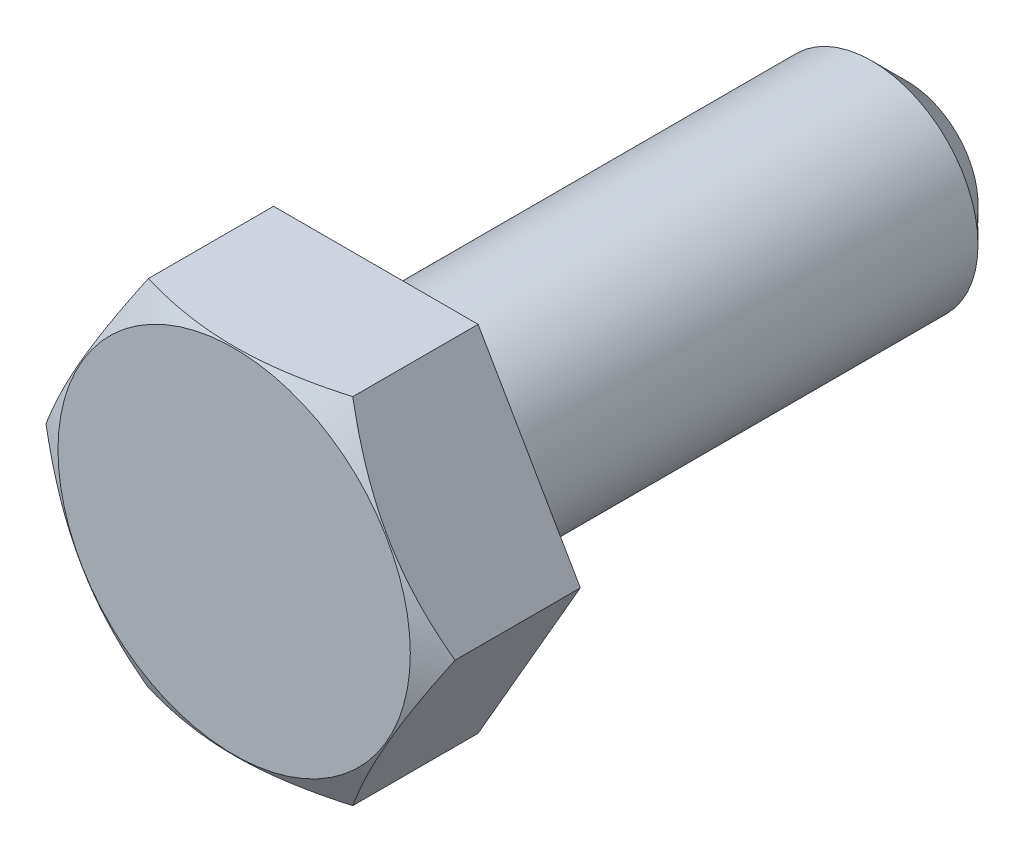
ISO-10303-21;
HEADER;
FILE_DESCRIPTION(('STEP AP214'),'2;1');
FILE_NAME('part.step','',(''),(''),'','','');
FILE_SCHEMA(('AUTOMOTIVE_DESIGN { 1 0 10303 214 1 1 1 1 }'));
ENDSEC;
DATA;
#1=APPLICATION_CONTEXT('core data for automotive mechanical design processes');
#2=APPLICATION_PROTOCOL_DEFINITION('international standard','automotive_design',2000,#1);
#3=PRODUCT_CONTEXT('',#1,'mechanical');
#4=PRODUCT('Part','Part','',(#3));
#5=PRODUCT_RELATED_PRODUCT_CATEGORY('part','',(#4));
#6=PRODUCT_DEFINITION_FORMATION('','',#4);
#7=PRODUCT_DEFINITION_CONTEXT('part definition',#1,'design');
#8=PRODUCT_DEFINITION('design','',#6,#7);
#9=PRODUCT_DEFINITION_SHAPE('','',#8);
#10=(LENGTH_UNIT() NAMED_UNIT(*) SI_UNIT(.MILLI.,.METRE.));
#11=(NAMED_UNIT(*) PLANE_ANGLE_UNIT() SI_UNIT($,.RADIAN.));
#12=(NAMED_UNIT(*) SI_UNIT($,.STERADIAN.) SOLID_ANGLE_UNIT());
#13=UNCERTAINTY_MEASURE_WITH_UNIT(LENGTH_MEASURE(1.E-05),#10,'distance_accuracy_value','');
#14=(GEOMETRIC_REPRESENTATION_CONTEXT(3) GLOBAL_UNCERTAINTY_ASSIGNED_CONTEXT((#13)) GLOBAL_UNIT_ASSIGNED_CONTEXT((#10,
#11,#12)) REPRESENTATION_CONTEXT('',''));
#15=CARTESIAN_POINT('',(0.,0.,0.));
#16=DIRECTION('',(0.,0.,1.));
#17=DIRECTION('',(1.,0.,0.));
#18=AXIS2_PLACEMENT_3D('',#15,#16,#17);
#19=CARTESIAN_POINT('',(2.88675134594813,-5.,4.));
#20=DIRECTION('',(-0.866025403784439,0.5,0.));
#21=DIRECTION('',(-0.5,-0.866025403784439,0.));
#22=AXIS2_PLACEMENT_3D('',#19,#20,#21);
#23=PLANE('',#22);
#24=CARTESIAN_POINT('',(2.88663587589429,-5.0002,3.53805311598168));
#25=CARTESIAN_POINT('',(3.01349970319368,-4.78046540547481,3.61131520439587));
#26=CARTESIAN_POINT('',(3.14144859993849,-4.55885141554042,3.67795045011541));
#27=CARTESIAN_POINT('',(3.39956193532121,-4.11178600454649,3.79426278102269));
#28=CARTESIAN_POINT('',(3.52973095989718,-3.88632664040923,3.84389872211772));
#29=CARTESIAN_POINT('',(3.78847564779798,-3.43816769477649,3.92115074661481));
#30=CARTESIAN_POINT('',(3.91701101576052,-3.21553790689581,3.94928139375001));
#31=CARTESIAN_POINT('',(4.11026620624322,-2.88081009815336,3.97450685007982));
#32=CARTESIAN_POINT('',(4.17472868879311,-2.76915780319494,3.98008831226402));
#33=CARTESIAN_POINT('',(4.30371322717528,-2.5457500293262,3.98549955528203));
#34=CARTESIAN_POINT('',(4.36823528110589,-2.43399455370969,3.9853295137753));
#35=CARTESIAN_POINT('',(4.54500768479194,-2.12781576914936,3.97694814024147));
#36=CARTESIAN_POINT('',(4.65719946015292,-1.93349391403279,3.96287200013625));
#37=CARTESIAN_POINT('',(4.88083840557981,-1.54613989800229,3.91823651492407));
#38=CARTESIAN_POINT('',(4.9922847895602,-1.35310909862843,3.887661911886));
#39=CARTESIAN_POINT('',(5.21637431361295,-0.964974657525144,3.81123327841234));
#40=CARTESIAN_POINT('',(5.32898917185759,-0.769920001358263,3.76505539315483));
#41=CARTESIAN_POINT('',(5.55253939626498,-0.382719654641229,3.66024997754157));
#42=CARTESIAN_POINT('',(5.66347762579592,-0.190569004591911,3.60164706859613));
#43=CARTESIAN_POINT('',(5.7736181619501,0.000200000000002566,3.53805311598168));
#44=B_SPLINE_CURVE_WITH_KNOTS('',3,(#24,#25,#26,#27,#28,#29,#30,#31,#32,#33,#34,#35,#36,#37,#38,
#39,#40,#41,#42,#43),.UNSPECIFIED.,.F.,.F.,(4,2,2,2,2,2,2,2,2,4),(0.,0.79255584136309,
1.58701660053333,2.3618153748728,2.74884076077325,3.13585419177295,3.80962362599679,
4.48401723901189,5.17336882348928,5.86136694793725),.UNSPECIFIED.);
#45=CARTESIAN_POINT('',(2.88675134594813,-5.,3.53811978464831));
#46=VERTEX_POINT('',#45);
#47=CARTESIAN_POINT('',(5.77350269189626,0.,3.53811978464831));
#48=VERTEX_POINT('',#47);
#49=EDGE_CURVE('E87',#46,#48,#44,.T.);
#50=ORIENTED_EDGE('',*,*,#49,.F.);
#51=DIRECTION('',(0.,0.,-1.));
#52=VECTOR('',#51,1.);
#53=CARTESIAN_POINT('',(2.88675134594813,-5.,4.));
#54=LINE('',#53,#52);
#55=CARTESIAN_POINT('',(2.88675134594813,-5.,0.));
#56=VERTEX_POINT('',#55);
#57=EDGE_CURVE('E56',#46,#56,#54,.T.);
#58=ORIENTED_EDGE('',*,*,#57,.T.);
#59=DIRECTION('',(0.5,0.866025403784439,0.));
#60=VECTOR('',#59,1.);
#61=CARTESIAN_POINT('',(2.88675134594813,-5.,0.));
#62=LINE('',#61,#60);
#63=CARTESIAN_POINT('',(5.77350269189626,0.,0.));
#64=VERTEX_POINT('',#63);
#65=EDGE_CURVE('E95',#56,#64,#62,.T.);
#66=ORIENTED_EDGE('',*,*,#65,.T.);
#67=DIRECTION('',(0.,0.,-1.));
#68=VECTOR('',#67,1.);
#69=CARTESIAN_POINT('',(5.77350269189626,0.,4.));
#70=LINE('',#69,#68);
#71=EDGE_CURVE('E94',#48,#64,#70,.T.);
#72=ORIENTED_EDGE('',*,*,#71,.F.);
#73=EDGE_LOOP('',(#50,#58,#66,#72));
#74=FACE_BOUND('',#73,.T.);
#75=ADVANCED_FACE('F33',(#74),#23,.F.);
#76=CARTESIAN_POINT('',(5.77350269189626,0.,4.));
#77=DIRECTION('',(-0.866025403784438,-0.5,0.));
#78=DIRECTION('',(0.5,-0.866025403784439,0.));
#79=AXIS2_PLACEMENT_3D('',#76,#77,#78);
#80=PLANE('',#79);
#81=CARTESIAN_POINT('',(5.7736181619501,-0.000199999999997309,3.53805311598168));
#82=CARTESIAN_POINT('',(5.64675433465071,0.219534594525188,3.61131520439587));
#83=CARTESIAN_POINT('',(5.5188054379059,0.441148584459583,3.67795045011541));
#84=CARTESIAN_POINT('',(5.26069210252318,0.888213995453515,3.79426278102269));
#85=CARTESIAN_POINT('',(5.13052307794721,1.11367335959078,3.84389872211772));
#86=CARTESIAN_POINT('',(4.87177839004641,1.56183230522351,3.92115074661481));
#87=CARTESIAN_POINT('',(4.74324302208387,1.78446209310419,3.94928139375001));
#88=CARTESIAN_POINT('',(4.54998783160116,2.11918990184664,3.97450685007982));
#89=CARTESIAN_POINT('',(4.48552534905128,2.23084219680506,3.98008831226402));
#90=CARTESIAN_POINT('',(4.35654081066911,2.4542499706738,3.98549955528203));
#91=CARTESIAN_POINT('',(4.2920187567385,2.56600544629031,3.9853295137753));
#92=CARTESIAN_POINT('',(4.11524635305244,2.87218423085064,3.97694814024147));
#93=CARTESIAN_POINT('',(4.00305457769146,3.06650608596721,3.96287200013625));
#94=CARTESIAN_POINT('',(3.77941563226457,3.45386010199771,3.91823651492407));
#95=CARTESIAN_POINT('',(3.66796924828418,3.64689090137157,3.887661911886));
#96=CARTESIAN_POINT('',(3.44387972423144,4.03502534247485,3.81123327841234));
#97=CARTESIAN_POINT('',(3.3312648659868,4.23007999864174,3.76505539315482));
#98=CARTESIAN_POINT('',(3.1077146415794,4.61728034535877,3.66024997754157));
#99=CARTESIAN_POINT('',(2.99677641204847,4.80943099540809,3.60164706859613));
#100=CARTESIAN_POINT('',(2.88663587589429,5.0002,3.53805311598168));
#101=B_SPLINE_CURVE_WITH_KNOTS('',3,(#81,#82,#83,#84,#85,#86,#87,#88,#89,#90,#91,#92,#93,#94,
#95,#96,#97,#98,#99,#100),.UNSPECIFIED.,.F.,.F.,(4,2,2,2,2,2,2,2,2,4),(0.,0.792555841363089,
1.58701660053333,2.3618153748728,2.74884076077325,3.13585419177295,3.80962362599679,
4.48401723901189,5.17336882348928,5.86136694793725),.UNSPECIFIED.);
#102=CARTESIAN_POINT('',(2.88675134594813,5.,3.53811978464831));
#103=VERTEX_POINT('',#102);
#104=EDGE_CURVE('E96',#48,#103,#101,.T.);
#105=ORIENTED_EDGE('',*,*,#104,.F.);
#106=ORIENTED_EDGE('',*,*,#71,.T.);
#107=DIRECTION('',(-0.5,0.866025403784438,0.));
#108=VECTOR('',#107,1.);
#109=CARTESIAN_POINT('',(5.77350269189626,0.,0.));
#110=LINE('',#109,#108);
#111=CARTESIAN_POINT('',(2.88675134594813,5.,0.));
#112=VERTEX_POINT('',#111);
#113=EDGE_CURVE('E282',#64,#112,#110,.T.);
#114=ORIENTED_EDGE('',*,*,#113,.T.);
#115=DIRECTION('',(0.,0.,-1.));
#116=VECTOR('',#115,1.);
#117=CARTESIAN_POINT('',(2.88675134594813,5.,4.));
#118=LINE('',#117,#116);
#119=EDGE_CURVE('E113',#103,#112,#118,.T.);
#120=ORIENTED_EDGE('',*,*,#119,.F.);
#121=EDGE_LOOP('',(#105,#106,#114,#120));
#122=FACE_BOUND('',#121,.T.);
#123=ADVANCED_FACE('F136',(#122),#80,.F.);
#124=CARTESIAN_POINT('',(2.88675134594813,5.,4.));
#125=DIRECTION('',(0.,-1.,0.));
#126=DIRECTION('',(0.,0.,-1.));
#127=AXIS2_PLACEMENT_3D('',#124,#125,#126);
#128=PLANE('',#127);
#129=CARTESIAN_POINT('',(-7.82338516873747,5.,1.51093835730114));
#130=CARTESIAN_POINT('',(-7.60438197690464,5.,1.61745101624925));
#131=CARTESIAN_POINT('',(-7.38488336024556,5.,1.72296210858919));
#132=CARTESIAN_POINT('',(-6.94463201643304,5.,1.93141911387655));
#133=CARTESIAN_POINT('',(-6.72387910419547,5.,2.03436463550559));
#134=CARTESIAN_POINT('',(-6.27975175628989,5.,2.2376314796622));
#135=CARTESIAN_POINT('',(-6.05636963189633,5.,2.33793605953245));
#136=CARTESIAN_POINT('',(-5.6078523892746,5.,2.53453096598181));
#137=CARTESIAN_POINT('',(-5.38271735252268,5.,2.6308214778305));
#138=CARTESIAN_POINT('',(-4.92287041955428,5.,2.82142512951252));
#139=CARTESIAN_POINT('',(-4.68808764320172,5.,2.91556818067449));
#140=CARTESIAN_POINT('',(-4.21580110971377,5.,3.09689531418389));
#141=CARTESIAN_POINT('',(-3.97829705446181,5.,3.18407862559214));
#142=CARTESIAN_POINT('',(-3.50061243500503,5.,3.34924863479384));
#143=CARTESIAN_POINT('',(-3.26043816280424,5.,3.42725335016425));
#144=CARTESIAN_POINT('',(-2.77664517159943,5.,3.57160921336287));
#145=CARTESIAN_POINT('',(-2.53302754080839,5.,3.63796395775378));
#146=CARTESIAN_POINT('',(-2.0435434734644,5.,3.75553285696888));
#147=CARTESIAN_POINT('',(-1.79769726961432,5.,3.80682971688414));
#148=CARTESIAN_POINT('',(-1.30287667014513,5.,3.89142161557658));
#149=CARTESIAN_POINT('',(-1.05390260442688,5.,3.92471853679513));
#150=CARTESIAN_POINT('',(-0.55735108034088,5.,3.97022151473848));
#151=CARTESIAN_POINT('',(-0.309799614974713,5.,3.9827042169782));
#152=CARTESIAN_POINT('',(0.185481530121079,5.,3.98625319724656));
#153=CARTESIAN_POINT('',(0.433211213294336,5.,3.97731904969401));
#154=CARTESIAN_POINT('',(0.851696393111856,5.,3.94477536113387));
#155=CARTESIAN_POINT('',(1.02289114163302,5.,3.92647096501586));
#156=CARTESIAN_POINT('',(1.36406544167886,5.,3.88073644281525));
#157=CARTESIAN_POINT('',(1.53404483327378,5.,3.85330513749713));
#158=CARTESIAN_POINT('',(2.04190752157204,5.,3.75875876729475));
#159=CARTESIAN_POINT('',(2.37754017644565,5.,3.67940671340158));
#160=CARTESIAN_POINT('',(2.87961021742162,5.,3.54129775467678));
#161=CARTESIAN_POINT('',(3.04863466648646,5.,3.49140605188312));
#162=CARTESIAN_POINT('',(3.38504221933191,5.,3.38631753851791));
#163=CARTESIAN_POINT('',(3.55242531088788,5.,3.33112068846725));
#164=CARTESIAN_POINT('',(3.88560260788616,5.,3.21631800828312));
#165=CARTESIAN_POINT('',(4.05139727317292,5.,3.15671350056889));
#166=CARTESIAN_POINT('',(4.38160293931627,5.,3.03380916945681));
#167=CARTESIAN_POINT('',(4.54601396838294,5.,2.97050942160873));
#168=CARTESIAN_POINT('',(4.97818946131638,5.,2.79943040590878));
#169=CARTESIAN_POINT('',(5.24492497437432,5.,2.68905464522093));
#170=CARTESIAN_POINT('',(5.77574777408935,5.,2.46208755306074));
#171=CARTESIAN_POINT('',(6.03983479512499,5.,2.3454956054192));
#172=CARTESIAN_POINT('',(6.56594822395386,5.,2.10752786254936));
#173=CARTESIAN_POINT('',(6.82797388396819,5.,1.98615041937866));
#174=CARTESIAN_POINT('',(7.35027595134517,5.,1.73972418057082));
#175=CARTESIAN_POINT('',(7.61055242142685,5.,1.61467551744153));
#176=CARTESIAN_POINT('',(8.13008095615318,5.,1.36149894749498));
#177=CARTESIAN_POINT('',(8.38933091460936,5.,1.23336672724167));
#178=CARTESIAN_POINT('',(8.90667323229434,5.,0.974783920345941));
#179=CARTESIAN_POINT('',(9.16476557965033,5.,0.844333309993208));
#180=CARTESIAN_POINT('',(9.93751637898695,5.,0.450249782646369));
#181=CARTESIAN_POINT('',(10.4507545727373,5.,0.183833031053398));
#182=CARTESIAN_POINT('',(11.422601795019,5.,-0.326689024091488));
#183=CARTESIAN_POINT('',(11.8814652209096,5.,-0.570312353621985));
#184=CARTESIAN_POINT('',(12.7976274105953,5.,-1.06054274925519));
#185=CARTESIAN_POINT('',(13.2549260858597,5.,-1.30714998071475));
#186=CARTESIAN_POINT('',(14.1668752234652,5.,-1.80180013202318));
#187=CARTESIAN_POINT('',(14.6215294878229,5.,-2.04983605338367));
#188=CARTESIAN_POINT('',(15.5298590845461,5.,-2.54761605645497));
#189=CARTESIAN_POINT('',(15.983534486119,5.,-2.79736001182691));
#190=CARTESIAN_POINT('',(16.4368630224376,5.,-3.04772806493142));
#191=B_SPLINE_CURVE_WITH_KNOTS('',3,(#129,#130,#131,#132,#133,#134,#135,#136,#137,#138,#139,
#140,#141,#142,#143,#144,#145,#146,#147,#148,#149,#150,#151,#152,#153,#154,#155,#156,#157,#158,
#159,#160,#161,#162,#163,#164,#165,#166,#167,#168,#169,#170,#171,#172,#173,#174,#175,#176,#177,
#178,#179,#180,#181,#182,#183,#184,#185,#186,#187,#188,#189,#190),.UNSPECIFIED.,.F.,.F.,(4,2,2,
2,2,2,2,2,2,2,2,2,2,2,2,2,2,2,2,2,2,2,2,2,2,2,2,2,2,2,4),(0.,0.730601581842776,1.46131392633547,
2.19588776483159,2.93042766140127,3.68920517307418,4.44806661919809,5.20541265096907,
5.96252446323718,6.71539651907229,7.46818982398268,8.21089544793544,8.95361583055579,
9.46987843434217,9.98620776737526,11.0193915395477,11.5480470476335,12.0767064900985,
12.605207958657,13.1336986257013,13.9995941934346,14.8655757517817,15.7318581714327,
16.5981093621082,17.4656522219737,18.3332039593614,20.0679531282939,21.6265218921787,
23.185177425408,24.7389080278055,26.2925249216014),.UNSPECIFIED.);
#192=CARTESIAN_POINT('',(-2.88675134594813,5.,3.53811978464831));
#193=VERTEX_POINT('',#192);
#194=EDGE_CURVE('E179',#103,#193,#191,.F.);
#195=ORIENTED_EDGE('',*,*,#194,.F.);
#196=ORIENTED_EDGE('',*,*,#119,.T.);
#197=DIRECTION('',(-1.,0.,0.));
#198=VECTOR('',#197,1.);
#199=CARTESIAN_POINT('',(2.88675134594813,5.,0.));
#200=LINE('',#199,#198);
#201=CARTESIAN_POINT('',(-2.88675134594813,5.,0.));
#202=VERTEX_POINT('',#201);
#203=EDGE_CURVE('E283',#112,#202,#200,.T.);
#204=ORIENTED_EDGE('',*,*,#203,.T.);
#205=DIRECTION('',(0.,0.,-1.));
#206=VECTOR('',#205,1.);
#207=CARTESIAN_POINT('',(-2.88675134594813,5.,4.));
#208=LINE('',#207,#206);
#209=EDGE_CURVE('E111',#193,#202,#208,.T.);
#210=ORIENTED_EDGE('',*,*,#209,.F.);
#211=EDGE_LOOP('',(#195,#196,#204,#210));
#212=FACE_BOUND('',#211,.T.);
#213=ADVANCED_FACE('F140',(#212),#128,.F.);
#214=CARTESIAN_POINT('',(-2.88675134594813,5.,4.));
#215=DIRECTION('',(0.866025403784439,-0.499999999999999,0.));
#216=DIRECTION('',(0.499999999999999,0.866025403784439,0.));
#217=AXIS2_PLACEMENT_3D('',#214,#215,#216);
#218=PLANE('',#217);
#219=CARTESIAN_POINT('',(-2.88663587589429,5.0002,3.53805311598168));
#220=CARTESIAN_POINT('',(-3.01349970319368,4.78046540547481,3.61131520439587));
#221=CARTESIAN_POINT('',(-3.14144859993849,4.55885141554042,3.67795045011541));
#222=CARTESIAN_POINT('',(-3.39956193532121,4.11178600454649,3.79426278102269));
#223=CARTESIAN_POINT('',(-3.52973095989718,3.88632664040923,3.84389872211772));
#224=CARTESIAN_POINT('',(-3.78847564779798,3.43816769477649,3.92115074661481));
#225=CARTESIAN_POINT('',(-3.91701101576052,3.21553790689581,3.94928139375001));
#226=CARTESIAN_POINT('',(-4.11026620624322,2.88081009815336,3.97450685007982));
#227=CARTESIAN_POINT('',(-4.17472868879311,2.76915780319494,3.98008831226402));
#228=CARTESIAN_POINT('',(-4.30371322717528,2.5457500293262,3.98549955528203));
#229=CARTESIAN_POINT('',(-4.36823528110589,2.43399455370969,3.9853295137753));
#230=CARTESIAN_POINT('',(-4.54500768479194,2.12781576914936,3.97694814024147));
#231=CARTESIAN_POINT('',(-4.65719946015292,1.93349391403279,3.96287200013625));
#232=CARTESIAN_POINT('',(-4.88083840557981,1.54613989800229,3.91823651492407));
#233=CARTESIAN_POINT('',(-4.9922847895602,1.35310909862843,3.887661911886));
#234=CARTESIAN_POINT('',(-5.21637431361295,0.964974657525143,3.81123327841234));
#235=CARTESIAN_POINT('',(-5.32898917185759,0.769920001358262,3.76505539315483));
#236=CARTESIAN_POINT('',(-5.55253939626498,0.382719654641229,3.66024997754157));
#237=CARTESIAN_POINT('',(-5.66347762579592,0.19056900459191,3.60164706859613));
#238=CARTESIAN_POINT('',(-5.77361816195009,-0.000200000000003066,3.53805311598168));
#239=B_SPLINE_CURVE_WITH_KNOTS('',3,(#219,#220,#221,#222,#223,#224,#225,#226,#227,#228,#229,
#230,#231,#232,#233,#234,#235,#236,#237,#238),.UNSPECIFIED.,.F.,.F.,(4,2,2,2,2,2,2,2,2,4),(0.,
0.792555841363089,1.58701660053333,2.3618153748728,2.74884076077325,3.13585419177295,
3.80962362599679,4.48401723901189,5.17336882348928,5.86136694793725),.UNSPECIFIED.);
#240=CARTESIAN_POINT('',(-5.77350269189626,0.,3.53811978464831));
#241=VERTEX_POINT('',#240);
#242=EDGE_CURVE('E174',#193,#241,#239,.T.);
#243=ORIENTED_EDGE('',*,*,#242,.F.);
#244=ORIENTED_EDGE('',*,*,#209,.T.);
#245=DIRECTION('',(-0.499999999999999,-0.866025403784439,0.));
#246=VECTOR('',#245,1.);
#247=CARTESIAN_POINT('',(-2.88675134594813,5.,0.));
#248=LINE('',#247,#246);
#249=CARTESIAN_POINT('',(-5.77350269189626,0.,0.));
#250=VERTEX_POINT('',#249);
#251=EDGE_CURVE('E286',#202,#250,#248,.T.);
#252=ORIENTED_EDGE('',*,*,#251,.T.);
#253=DIRECTION('',(0.,0.,-1.));
#254=VECTOR('',#253,1.);
#255=CARTESIAN_POINT('',(-5.77350269189626,0.,4.));
#256=LINE('',#255,#254);
#257=EDGE_CURVE('E104',#241,#250,#256,.T.);
#258=ORIENTED_EDGE('',*,*,#257,.F.);
#259=EDGE_LOOP('',(#243,#244,#252,#258));
#260=FACE_BOUND('',#259,.T.);
#261=ADVANCED_FACE('F185',(#260),#218,.F.);
#262=CARTESIAN_POINT('',(-5.77350269189626,0.,4.));
#263=DIRECTION('',(0.866025403784438,0.5,0.));
#264=DIRECTION('',(-0.5,0.866025403784439,0.));
#265=AXIS2_PLACEMENT_3D('',#262,#263,#264);
#266=PLANE('',#265);
#267=CARTESIAN_POINT('',(-5.77361816195009,0.00019999999999696,3.53805311598168));
#268=CARTESIAN_POINT('',(-5.6467543346507,-0.219534594525188,3.61131520439587));
#269=CARTESIAN_POINT('',(-5.51880543790589,-0.441148584459583,3.67795045011542));
#270=CARTESIAN_POINT('',(-5.26069210252318,-0.888213995453515,3.79426278102269));
#271=CARTESIAN_POINT('',(-5.13052307794721,-1.11367335959078,3.84389872211772));
#272=CARTESIAN_POINT('',(-4.87177839004641,-1.56183230522351,3.92115074661481));
#273=CARTESIAN_POINT('',(-4.74324302208387,-1.78446209310419,3.94928139375001));
#274=CARTESIAN_POINT('',(-4.54998783160116,-2.11918990184664,3.97450685007982));
#275=CARTESIAN_POINT('',(-4.48552534905128,-2.23084219680506,3.98008831226402));
#276=CARTESIAN_POINT('',(-4.35654081066911,-2.4542499706738,3.98549955528203));
#277=CARTESIAN_POINT('',(-4.2920187567385,-2.56600544629031,3.9853295137753));
#278=CARTESIAN_POINT('',(-4.11524635305244,-2.87218423085064,3.97694814024147));
#279=CARTESIAN_POINT('',(-4.00305457769146,-3.06650608596721,3.96287200013625));
#280=CARTESIAN_POINT('',(-3.77941563226457,-3.45386010199771,3.91823651492407));
#281=CARTESIAN_POINT('',(-3.66796924828418,-3.64689090137157,3.887661911886));
#282=CARTESIAN_POINT('',(-3.44387972423144,-4.03502534247485,3.81123327841234));
#283=CARTESIAN_POINT('',(-3.3312648659868,-4.23007999864174,3.76505539315483));
#284=CARTESIAN_POINT('',(-3.1077146415794,-4.61728034535877,3.66024997754157));
#285=CARTESIAN_POINT('',(-2.99677641204847,-4.80943099540809,3.60164706859613));
#286=CARTESIAN_POINT('',(-2.88663587589429,-5.0002,3.53805311598168));
#287=B_SPLINE_CURVE_WITH_KNOTS('',3,(#267,#268,#269,#270,#271,#272,#273,#274,#275,#276,#277,
#278,#279,#280,#281,#282,#283,#284,#285,#286),.UNSPECIFIED.,.F.,.F.,(4,2,2,2,2,2,2,2,2,4),(0.,
0.79255584136309,1.58701660053333,2.3618153748728,2.74884076077325,3.13585419177294,
3.80962362599679,4.48401723901189,5.17336882348928,5.86136694793725),.UNSPECIFIED.);
#288=CARTESIAN_POINT('',(-2.88675134594813,-5.,3.53811978464831));
#289=VERTEX_POINT('',#288);
#290=EDGE_CURVE('E48',#241,#289,#287,.T.);
#291=ORIENTED_EDGE('',*,*,#290,.F.);
#292=ORIENTED_EDGE('',*,*,#257,.T.);
#293=DIRECTION('',(0.5,-0.866025403784438,0.));
#294=VECTOR('',#293,1.);
#295=CARTESIAN_POINT('',(-5.77350269189626,0.,0.));
#296=LINE('',#295,#294);
#297=CARTESIAN_POINT('',(-2.88675134594813,-5.,0.));
#298=VERTEX_POINT('',#297);
#299=EDGE_CURVE('E106',#250,#298,#296,.T.);
#300=ORIENTED_EDGE('',*,*,#299,.T.);
#301=DIRECTION('',(0.,0.,-1.));
#302=VECTOR('',#301,1.);
#303=CARTESIAN_POINT('',(-2.88675134594813,-5.,4.));
#304=LINE('',#303,#302);
#305=EDGE_CURVE('E102',#289,#298,#304,.T.);
#306=ORIENTED_EDGE('',*,*,#305,.F.);
#307=EDGE_LOOP('',(#291,#292,#300,#306));
#308=FACE_BOUND('',#307,.T.);
#309=ADVANCED_FACE('F189',(#308),#266,.F.);
#310=CARTESIAN_POINT('',(-2.88675134594813,-5.,4.));
#311=DIRECTION('',(0.,1.,0.));
#312=DIRECTION('',(-1.,0.,0.));
#313=AXIS2_PLACEMENT_3D('',#310,#311,#312);
#314=PLANE('',#313);
#315=CARTESIAN_POINT('',(-7.82338517032248,-5.,1.51093835653007));
#316=CARTESIAN_POINT('',(-7.60438197843631,-5.,1.61745101551037));
#317=CARTESIAN_POINT('',(-7.38488336172386,-5.,1.72296210788249));
#318=CARTESIAN_POINT('',(-6.94463201780443,-5.,1.93141911323404));
#319=CARTESIAN_POINT('',(-6.72387910551334,-5.,2.0343646348951));
#320=CARTESIAN_POINT('',(-6.27975175749986,-5.,2.23763147911577));
#321=CARTESIAN_POINT('',(-6.05636963305194,-5.,2.33793605901806));
#322=CARTESIAN_POINT('',(-5.60785239032111,-5.,2.53453096553097));
#323=CARTESIAN_POINT('',(-5.38271735351447,-5.,2.63082147741116));
#324=CARTESIAN_POINT('',(-4.92287042043243,-5.,2.82142512915706));
#325=CARTESIAN_POINT('',(-4.68808764402091,-5.,2.91556818035134));
#326=CARTESIAN_POINT('',(-4.21580111041411,-5.,3.09689531392363));
#327=CARTESIAN_POINT('',(-3.97829705510226,-5.,3.18407862536247));
#328=CARTESIAN_POINT('',(-3.50061243552456,-5.,3.34924863462241));
#329=CARTESIAN_POINT('',(-3.26043816326276,-5.,3.42725335002048));
#330=CARTESIAN_POINT('',(-2.77664517193428,-5.,3.57160921326991));
#331=CARTESIAN_POINT('',(-2.53302754108057,-5.,3.63796395768396));
#332=CARTESIAN_POINT('',(-2.04354347357902,-5.,3.75553285694577));
#333=CARTESIAN_POINT('',(-1.7976972696336,-5.,3.80682971688278));
#334=CARTESIAN_POINT('',(-1.30287666997146,-5.,3.89142161560433));
#335=CARTESIAN_POINT('',(-1.05390260415559,-5.,3.92471853683026));
#336=CARTESIAN_POINT('',(-0.557351079875954,-5.,3.97022151477097));
#337=CARTESIAN_POINT('',(-0.309799614413798,-5.,3.98270421700098));
#338=CARTESIAN_POINT('',(0.185481530872498,-5.,3.9862531972332));
#339=CARTESIAN_POINT('',(0.43321121414027,-5.,3.9773190496542));
#340=CARTESIAN_POINT('',(0.851696394076569,-5.,3.94477536104072));
#341=CARTESIAN_POINT('',(1.02289114262307,-5.,3.92647096490155));
#342=CARTESIAN_POINT('',(1.36406544271844,-5.,3.8807364426575));
#343=CARTESIAN_POINT('',(1.53404483433756,-5.,3.85330513731709));
#344=CARTESIAN_POINT('',(2.04190752270712,-5.,3.75875876704739));
#345=CARTESIAN_POINT('',(2.37754017762639,-5.,3.67940671310874));
#346=CARTESIAN_POINT('',(2.87961021867067,-5.,3.54129775431683));
#347=CARTESIAN_POINT('',(3.04863466775877,-5.,3.49140605150064));
#348=CARTESIAN_POINT('',(3.38504222065047,-5.,3.38631753809105));
#349=CARTESIAN_POINT('',(3.55242531222943,-5.,3.33112068801855));
#350=CARTESIAN_POINT('',(3.88560260927354,-5.,3.21631800779151));
#351=CARTESIAN_POINT('',(4.05139727458313,-5.,3.15671350005621));
#352=CARTESIAN_POINT('',(4.38160294077214,-5.,3.03380916890273));
#353=CARTESIAN_POINT('',(4.54601396986164,-5.,2.97050942103432));
#354=CARTESIAN_POINT('',(4.97818946280862,-5.,2.7994304053001));
#355=CARTESIAN_POINT('',(5.24492497585788,-5.,2.68905464460033));
#356=CARTESIAN_POINT('',(5.77574777555665,-5.,2.46208755241965));
#357=CARTESIAN_POINT('',(6.03983479658471,-5.,2.34549560476954));
#358=CARTESIAN_POINT('',(6.56594822539923,-5.,2.10752786188501));
#359=CARTESIAN_POINT('',(6.82797388540678,-5.,1.98615041870819));
#360=CARTESIAN_POINT('',(7.35027595277094,-5.,1.73972417988986));
#361=CARTESIAN_POINT('',(7.61055242284657,-5.,1.61467551675621));
#362=CARTESIAN_POINT('',(8.13008095756101,-5.,1.36149894680237));
#363=CARTESIAN_POINT('',(8.38933091601135,-5.,1.23336672654616));
#364=CARTESIAN_POINT('',(8.90667323368507,-5.,0.974783919645591));
#365=CARTESIAN_POINT('',(9.16476558103566,-5.,0.844333309290929));
#366=CARTESIAN_POINT('',(9.9375163803567,-5.,0.450249781939346));
#367=CARTESIAN_POINT('',(10.4507545740974,-5.,0.183833030344654));
#368=CARTESIAN_POINT('',(11.4226017963694,-5.,-0.326689024805972));
#369=CARTESIAN_POINT('',(11.8814652222598,-5.,-0.570312354340724));
#370=CARTESIAN_POINT('',(12.7976274119457,-5.,-1.06054274998157));
#371=CARTESIAN_POINT('',(13.2549260872103,-4.99999999999999,-1.30714998144451));
#372=CARTESIAN_POINT('',(14.1668752248181,-4.99999999999999,-1.80180013275984));
#373=CARTESIAN_POINT('',(14.6215294891776,-4.99999999999999,-2.04983605412383));
#374=CARTESIAN_POINT('',(15.5298590859048,-4.99999999999999,-2.54761605720176));
#375=CARTESIAN_POINT('',(15.9835344874798,-4.99999999999999,-2.79736001257681));
#376=CARTESIAN_POINT('',(16.4368630238006,-4.99999999999999,-3.04772806568431));
#377=B_SPLINE_CURVE_WITH_KNOTS('',3,(#315,#316,#317,#318,#319,#320,#321,#322,#323,#324,#325,
#326,#327,#328,#329,#330,#331,#332,#333,#334,#335,#336,#337,#338,#339,#340,#341,#342,#343,#344,
#345,#346,#347,#348,#349,#350,#351,#352,#353,#354,#355,#356,#357,#358,#359,#360,#361,#362,#363,
#364,#365,#366,#367,#368,#369,#370,#371,#372,#373,#374,#375,#376),.UNSPECIFIED.,.F.,.F.,(4,2,2,
2,2,2,2,2,2,2,2,2,2,2,2,2,2,2,2,2,2,2,2,2,2,2,2,2,2,2,4),(0.,0.730601582028906,1.46131392670775,
2.19588776539201,2.93042766214982,3.68920517402293,4.44806662034711,5.2054126523177,
5.96252446478525,6.71539652091303,7.46818982611567,8.21089545035345,8.95361583325898,
9.46987843712766,9.98620777024306,11.0193915425804,11.5480470507523,12.0767064933034,
12.6052079619478,13.1336986290779,13.999594196801,14.8655757551377,15.731858174778,
16.5981093654429,17.4656522252965,18.3332039626724,20.0679531315816,21.626521895472,
23.1851774287069,24.7389080311142,26.2925249249203),.UNSPECIFIED.);
#378=EDGE_CURVE('E85',#289,#46,#377,.T.);
#379=ORIENTED_EDGE('',*,*,#378,.F.);
#380=ORIENTED_EDGE('',*,*,#305,.T.);
#381=DIRECTION('',(1.,0.,0.));
#382=VECTOR('',#381,1.);
#383=CARTESIAN_POINT('',(-2.88675134594813,-5.,0.));
#384=LINE('',#383,#382);
#385=EDGE_CURVE('E100',#298,#56,#384,.T.);
#386=ORIENTED_EDGE('',*,*,#385,.T.);
#387=ORIENTED_EDGE('',*,*,#57,.F.);
#388=EDGE_LOOP('',(#379,#380,#386,#387));
#389=FACE_BOUND('',#388,.T.);
#390=ADVANCED_FACE('F98',(#389),#314,.F.);
#391=CARTESIAN_POINT('',(0.,0.,0.));
#392=DIRECTION('',(0.,0.,1.));
#393=DIRECTION('',(1.,0.,0.));
#394=AXIS2_PLACEMENT_3D('',#391,#392,#393);
#395=PLANE('',#394);
#396=ORIENTED_EDGE('',*,*,#65,.F.);
#397=ORIENTED_EDGE('',*,*,#385,.F.);
#398=ORIENTED_EDGE('',*,*,#299,.F.);
#399=ORIENTED_EDGE('',*,*,#251,.F.);
#400=ORIENTED_EDGE('',*,*,#203,.F.);
#401=ORIENTED_EDGE('',*,*,#113,.F.);
#402=EDGE_LOOP('',(#396,#397,#398,#399,#400,#401));
#403=FACE_BOUND('',#402,.T.);
#404=CARTESIAN_POINT('',(0.,0.,0.));
#405=DIRECTION('',(0.,0.,1.));
#406=DIRECTION('',(1.,0.,0.));
#407=AXIS2_PLACEMENT_3D('',#404,#405,#406);
#408=CIRCLE('',#407,3.);
#409=CARTESIAN_POINT('',(3.,0.,0.));
#410=VERTEX_POINT('',#409);
#411=EDGE_CURVE('E116',#410,#410,#408,.F.);
#412=ORIENTED_EDGE('',*,*,#411,.F.);
#413=EDGE_LOOP('',(#412));
#414=FACE_BOUND('',#413,.T.);
#415=ADVANCED_FACE('F197',(#403,#414),#395,.F.);
#416=CARTESIAN_POINT('',(0.,0.,-15.));
#417=DIRECTION('',(0.,0.,1.));
#418=DIRECTION('',(1.,0.,0.));
#419=AXIS2_PLACEMENT_3D('',#416,#417,#418);
#420=CYLINDRICAL_SURFACE('',#419,3.);
#421=CARTESIAN_POINT('',(0.,0.,-14.));
#422=DIRECTION('',(0.,0.,-1.));
#423=DIRECTION('',(-1.,0.,0.));
#424=AXIS2_PLACEMENT_3D('',#421,#422,#423);
#425=CIRCLE('',#424,3.);
#426=CARTESIAN_POINT('',(-3.,0.,-14.));
#427=VERTEX_POINT('',#426);
#428=EDGE_CURVE('E11',#427,#427,#425,.F.);
#429=ORIENTED_EDGE('',*,*,#428,.T.);
#430=EDGE_LOOP('',(#429));
#431=FACE_BOUND('',#430,.T.);
#432=ORIENTED_EDGE('',*,*,#411,.T.);
#433=EDGE_LOOP('',(#432));
#434=FACE_BOUND('',#433,.T.);
#435=ADVANCED_FACE('F132',(#431,#434),#420,.T.);
#436=CARTESIAN_POINT('',(0.,0.,-15.));
#437=DIRECTION('',(0.,0.,-1.));
#438=DIRECTION('',(-1.,0.,0.));
#439=AXIS2_PLACEMENT_3D('',#436,#437,#438);
#440=PLANE('',#439);
#441=CARTESIAN_POINT('',(0.,0.,-15.));
#442=DIRECTION('',(0.,0.,-1.));
#443=DIRECTION('',(-1.,0.,0.));
#444=AXIS2_PLACEMENT_3D('',#441,#442,#443);
#445=CIRCLE('',#444,2.);
#446=CARTESIAN_POINT('',(-2.,0.,-15.));
#447=VERTEX_POINT('',#446);
#448=EDGE_CURVE('E41',#447,#447,#445,.T.);
#449=ORIENTED_EDGE('',*,*,#448,.T.);
#450=EDGE_LOOP('',(#449));
#451=FACE_BOUND('',#450,.T.);
#452=ADVANCED_FACE('F121',(#451),#440,.T.);
#453=CARTESIAN_POINT('',(0.,0.,-15.));
#454=DIRECTION('',(0.,0.,1.));
#455=DIRECTION('',(1.,0.,0.));
#456=AXIS2_PLACEMENT_3D('',#453,#454,#455);
#457=CONICAL_SURFACE('',#456,2.,0.785398163397446);
#458=ORIENTED_EDGE('',*,*,#428,.F.);
#459=EDGE_LOOP('',(#458));
#460=FACE_BOUND('',#459,.T.);
#461=ORIENTED_EDGE('',*,*,#448,.F.);
#462=EDGE_LOOP('',(#461));
#463=FACE_BOUND('',#462,.T.);
#464=ADVANCED_FACE('F35',(#460,#463),#457,.T.);
#465=CARTESIAN_POINT('',(0.,0.,4.));
#466=DIRECTION('',(0.,0.,-1.));
#467=DIRECTION('',(-1.,0.,0.));
#468=AXIS2_PLACEMENT_3D('',#465,#466,#467);
#469=CONICAL_SURFACE('',#468,4.97350269189626,1.0471975511966);
#470=CARTESIAN_POINT('',(0.,0.,4.));
#471=DIRECTION('',(0.,0.,1.));
#472=DIRECTION('',(1.,0.,0.));
#473=AXIS2_PLACEMENT_3D('',#470,#471,#472);
#474=CIRCLE('',#473,4.97350269189626);
#475=CARTESIAN_POINT('',(4.97350269189626,0.,4.));
#476=VERTEX_POINT('',#475);
#477=EDGE_CURVE('E91',#476,#476,#474,.T.);
#478=ORIENTED_EDGE('',*,*,#477,.F.);
#479=EDGE_LOOP('',(#478));
#480=FACE_BOUND('',#479,.T.);
#481=ORIENTED_EDGE('',*,*,#49,.T.);
#482=ORIENTED_EDGE('',*,*,#104,.T.);
#483=ORIENTED_EDGE('',*,*,#194,.T.);
#484=ORIENTED_EDGE('',*,*,#242,.T.);
#485=ORIENTED_EDGE('',*,*,#290,.T.);
#486=ORIENTED_EDGE('',*,*,#378,.T.);
#487=EDGE_LOOP('',(#481,#482,#483,#484,#485,#486));
#488=FACE_BOUND('',#487,.T.);
#489=ADVANCED_FACE('F86',(#480,#488),#469,.T.);
#490=CARTESIAN_POINT('',(0.,0.,4.));
#491=DIRECTION('',(0.,0.,1.));
#492=DIRECTION('',(1.,0.,0.));
#493=AXIS2_PLACEMENT_3D('',#490,#491,#492);
#494=PLANE('',#493);
#495=ORIENTED_EDGE('',*,*,#477,.T.);
#496=EDGE_LOOP('',(#495));
#497=FACE_BOUND('',#496,.T.);
#498=ADVANCED_FACE('F129',(#497),#494,.T.);
#499=CLOSED_SHELL('',(#75,#123,#213,#261,#309,#390,#415,#435,#452,#464,#489,#498));
#500=MANIFOLD_SOLID_BREP('B2',#499);
#501=ADVANCED_BREP_SHAPE_REPRESENTATION('',(#18,#500),#14);
#502=SHAPE_DEFINITION_REPRESENTATION(#9,#501);
ENDSEC;
END-ISO-10303-21;
